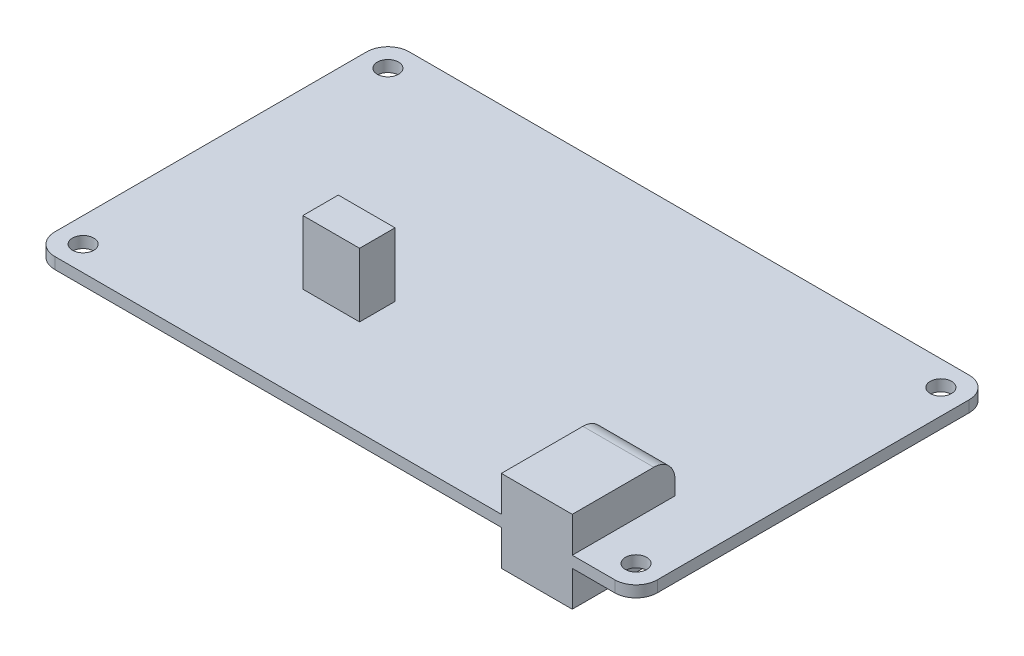
ISO-10303-21;
HEADER;
FILE_DESCRIPTION(('STEP AP214'),'2;1');
FILE_NAME('part.step','',(''),(''),'','','');
FILE_SCHEMA(('AUTOMOTIVE_DESIGN { 1 0 10303 214 1 1 1 1 }'));
ENDSEC;
DATA;
#1=APPLICATION_CONTEXT('core data for automotive mechanical design processes');
#2=APPLICATION_PROTOCOL_DEFINITION('international standard','automotive_design',2000,#1);
#3=PRODUCT_CONTEXT('',#1,'mechanical');
#4=PRODUCT('Part','Part','',(#3));
#5=PRODUCT_RELATED_PRODUCT_CATEGORY('part','',(#4));
#6=PRODUCT_DEFINITION_FORMATION('','',#4);
#7=PRODUCT_DEFINITION_CONTEXT('part definition',#1,'design');
#8=PRODUCT_DEFINITION('design','',#6,#7);
#9=PRODUCT_DEFINITION_SHAPE('','',#8);
#10=(LENGTH_UNIT() NAMED_UNIT(*) SI_UNIT(.MILLI.,.METRE.));
#11=(NAMED_UNIT(*) PLANE_ANGLE_UNIT() SI_UNIT($,.RADIAN.));
#12=(NAMED_UNIT(*) SI_UNIT($,.STERADIAN.) SOLID_ANGLE_UNIT());
#13=UNCERTAINTY_MEASURE_WITH_UNIT(LENGTH_MEASURE(1.E-05),#10,'distance_accuracy_value','');
#14=(GEOMETRIC_REPRESENTATION_CONTEXT(3) GLOBAL_UNCERTAINTY_ASSIGNED_CONTEXT((#13)) GLOBAL_UNIT_ASSIGNED_CONTEXT((#10,
#11,#12)) REPRESENTATION_CONTEXT('',''));
#15=CARTESIAN_POINT('',(0.,0.,0.));
#16=DIRECTION('',(0.,0.,1.));
#17=DIRECTION('',(1.,0.,0.));
#18=AXIS2_PLACEMENT_3D('',#15,#16,#17);
#19=CARTESIAN_POINT('',(0.,0.,0.));
#20=DIRECTION('',(0.,1.,0.));
#21=DIRECTION('',(0.,0.,1.));
#22=AXIS2_PLACEMENT_3D('',#19,#20,#21);
#23=PLANE('',#22);
#24=CARTESIAN_POINT('',(-39.,0.,21.5));
#25=DIRECTION('',(0.,1.,0.));
#26=DIRECTION('',(0.,0.,1.));
#27=AXIS2_PLACEMENT_3D('',#24,#25,#26);
#28=CIRCLE('',#27,1.5);
#29=CARTESIAN_POINT('',(-39.,0.,23.));
#30=VERTEX_POINT('',#29);
#31=EDGE_CURVE('E278',#30,#30,#28,.T.);
#32=ORIENTED_EDGE('',*,*,#31,.T.);
#33=EDGE_LOOP('',(#32));
#34=FACE_BOUND('',#33,.T.);
#35=CARTESIAN_POINT('',(39.,0.,21.5));
#36=DIRECTION('',(0.,1.,0.));
#37=DIRECTION('',(0.,0.,1.));
#38=AXIS2_PLACEMENT_3D('',#35,#36,#37);
#39=CIRCLE('',#38,1.5);
#40=CARTESIAN_POINT('',(39.,0.,23.));
#41=VERTEX_POINT('',#40);
#42=EDGE_CURVE('E282',#41,#41,#39,.T.);
#43=ORIENTED_EDGE('',*,*,#42,.T.);
#44=EDGE_LOOP('',(#43));
#45=FACE_BOUND('',#44,.T.);
#46=CARTESIAN_POINT('',(39.,0.,-21.5));
#47=DIRECTION('',(0.,1.,0.));
#48=DIRECTION('',(0.,0.,1.));
#49=AXIS2_PLACEMENT_3D('',#46,#47,#48);
#50=CIRCLE('',#49,1.5);
#51=CARTESIAN_POINT('',(39.,0.,-20.));
#52=VERTEX_POINT('',#51);
#53=EDGE_CURVE('E288',#52,#52,#50,.T.);
#54=ORIENTED_EDGE('',*,*,#53,.T.);
#55=EDGE_LOOP('',(#54));
#56=FACE_BOUND('',#55,.T.);
#57=CARTESIAN_POINT('',(-39.,0.,-21.5));
#58=DIRECTION('',(0.,1.,0.));
#59=DIRECTION('',(0.,0.,1.));
#60=AXIS2_PLACEMENT_3D('',#57,#58,#59);
#61=CIRCLE('',#60,1.5);
#62=CARTESIAN_POINT('',(-39.,0.,-20.));
#63=VERTEX_POINT('',#62);
#64=EDGE_CURVE('E294',#63,#63,#61,.T.);
#65=ORIENTED_EDGE('',*,*,#64,.T.);
#66=EDGE_LOOP('',(#65));
#67=FACE_BOUND('',#66,.T.);
#68=DIRECTION('',(0.,0.,1.));
#69=VECTOR('',#68,1.);
#70=CARTESIAN_POINT('',(33.5,0.,25.));
#71=LINE('',#70,#69);
#72=CARTESIAN_POINT('',(33.5,0.,10.5));
#73=VERTEX_POINT('',#72);
#74=CARTESIAN_POINT('',(33.5,0.,25.));
#75=VERTEX_POINT('',#74);
#76=EDGE_CURVE('E217',#73,#75,#71,.T.);
#77=ORIENTED_EDGE('',*,*,#76,.F.);
#78=DIRECTION('',(1.,0.,0.));
#79=VECTOR('',#78,1.);
#80=CARTESIAN_POINT('',(33.5,0.,10.5));
#81=LINE('',#80,#79);
#82=CARTESIAN_POINT('',(23.5,0.,10.5));
#83=VERTEX_POINT('',#82);
#84=EDGE_CURVE('E202',#83,#73,#81,.T.);
#85=ORIENTED_EDGE('',*,*,#84,.F.);
#86=DIRECTION('',(0.,0.,-1.));
#87=VECTOR('',#86,1.);
#88=CARTESIAN_POINT('',(23.5,0.,25.));
#89=LINE('',#88,#87);
#90=CARTESIAN_POINT('',(23.5,0.,25.));
#91=VERTEX_POINT('',#90);
#92=EDGE_CURVE('E458',#91,#83,#89,.T.);
#93=ORIENTED_EDGE('',*,*,#92,.F.);
#94=DIRECTION('',(1.,0.,0.));
#95=VECTOR('',#94,1.);
#96=CARTESIAN_POINT('',(-42.5,0.,25.));
#97=LINE('',#96,#95);
#98=CARTESIAN_POINT('',(-39.5,0.,25.));
#99=VERTEX_POINT('',#98);
#100=EDGE_CURVE('E307',#99,#91,#97,.T.);
#101=ORIENTED_EDGE('',*,*,#100,.F.);
#102=CARTESIAN_POINT('',(-39.5,0.,22.));
#103=DIRECTION('',(0.,1.,0.));
#104=DIRECTION('',(0.,0.,1.));
#105=AXIS2_PLACEMENT_3D('',#102,#103,#104);
#106=CIRCLE('',#105,3.);
#107=CARTESIAN_POINT('',(-42.5,0.,22.));
#108=VERTEX_POINT('',#107);
#109=EDGE_CURVE('E333',#99,#108,#106,.F.);
#110=ORIENTED_EDGE('',*,*,#109,.T.);
#111=DIRECTION('',(0.,0.,1.));
#112=VECTOR('',#111,1.);
#113=CARTESIAN_POINT('',(-42.5,0.,-25.));
#114=LINE('',#113,#112);
#115=CARTESIAN_POINT('',(-42.5,0.,-22.));
#116=VERTEX_POINT('',#115);
#117=EDGE_CURVE('E322',#116,#108,#114,.T.);
#118=ORIENTED_EDGE('',*,*,#117,.F.);
#119=CARTESIAN_POINT('',(-39.5,0.,-22.));
#120=DIRECTION('',(0.,1.,0.));
#121=DIRECTION('',(0.,0.,1.));
#122=AXIS2_PLACEMENT_3D('',#119,#120,#121);
#123=CIRCLE('',#122,3.);
#124=CARTESIAN_POINT('',(-39.5,0.,-25.));
#125=VERTEX_POINT('',#124);
#126=EDGE_CURVE('E331',#116,#125,#123,.F.);
#127=ORIENTED_EDGE('',*,*,#126,.T.);
#128=DIRECTION('',(-1.,0.,0.));
#129=VECTOR('',#128,1.);
#130=CARTESIAN_POINT('',(-42.5,0.,-25.));
#131=LINE('',#130,#129);
#132=CARTESIAN_POINT('',(39.5,0.,-25.));
#133=VERTEX_POINT('',#132);
#134=EDGE_CURVE('E319',#133,#125,#131,.T.);
#135=ORIENTED_EDGE('',*,*,#134,.F.);
#136=CARTESIAN_POINT('',(39.5,0.,-22.));
#137=DIRECTION('',(0.,1.,0.));
#138=DIRECTION('',(0.,0.,1.));
#139=AXIS2_PLACEMENT_3D('',#136,#137,#138);
#140=CIRCLE('',#139,3.);
#141=CARTESIAN_POINT('',(42.5,0.,-22.));
#142=VERTEX_POINT('',#141);
#143=EDGE_CURVE('E338',#133,#142,#140,.F.);
#144=ORIENTED_EDGE('',*,*,#143,.T.);
#145=DIRECTION('',(0.,0.,-1.));
#146=VECTOR('',#145,1.);
#147=CARTESIAN_POINT('',(42.5,0.,-25.));
#148=LINE('',#147,#146);
#149=CARTESIAN_POINT('',(42.5,0.,22.));
#150=VERTEX_POINT('',#149);
#151=EDGE_CURVE('E300',#150,#142,#148,.T.);
#152=ORIENTED_EDGE('',*,*,#151,.F.);
#153=CARTESIAN_POINT('',(39.5,0.,22.));
#154=DIRECTION('',(0.,1.,0.));
#155=DIRECTION('',(0.,0.,1.));
#156=AXIS2_PLACEMENT_3D('',#153,#154,#155);
#157=CIRCLE('',#156,3.);
#158=CARTESIAN_POINT('',(39.5,0.,25.));
#159=VERTEX_POINT('',#158);
#160=EDGE_CURVE('E335',#150,#159,#157,.F.);
#161=ORIENTED_EDGE('',*,*,#160,.T.);
#162=EDGE_CURVE('E325',#75,#159,#97,.T.);
#163=ORIENTED_EDGE('',*,*,#162,.F.);
#164=EDGE_LOOP('',(#77,#85,#93,#101,#110,#118,#127,#135,#144,#152,#161,#163));
#165=FACE_BOUND('',#164,.T.);
#166=ADVANCED_FACE('F45',(#34,#45,#56,#67,#165),#23,.F.);
#167=CARTESIAN_POINT('',(0.,1.6,0.));
#168=DIRECTION('',(0.,1.,0.));
#169=DIRECTION('',(0.,0.,1.));
#170=AXIS2_PLACEMENT_3D('',#167,#168,#169);
#171=PLANE('',#170);
#172=DIRECTION('',(0.,0.,-1.));
#173=VECTOR('',#172,1.);
#174=CARTESIAN_POINT('',(33.5,1.6,25.));
#175=LINE('',#174,#173);
#176=CARTESIAN_POINT('',(33.5,1.6,25.));
#177=VERTEX_POINT('',#176);
#178=CARTESIAN_POINT('',(33.5,1.6,10.5));
#179=VERTEX_POINT('',#178);
#180=EDGE_CURVE('E252',#177,#179,#175,.T.);
#181=ORIENTED_EDGE('',*,*,#180,.F.);
#182=DIRECTION('',(1.,0.,0.));
#183=VECTOR('',#182,1.);
#184=CARTESIAN_POINT('',(-42.5,1.6,25.));
#185=LINE('',#184,#183);
#186=CARTESIAN_POINT('',(39.5,1.6,25.));
#187=VERTEX_POINT('',#186);
#188=EDGE_CURVE('E313',#177,#187,#185,.T.);
#189=ORIENTED_EDGE('',*,*,#188,.T.);
#190=CARTESIAN_POINT('',(39.5,1.6,22.));
#191=DIRECTION('',(0.,1.,0.));
#192=DIRECTION('',(0.,0.,1.));
#193=AXIS2_PLACEMENT_3D('',#190,#191,#192);
#194=CIRCLE('',#193,3.);
#195=CARTESIAN_POINT('',(42.5,1.6,22.));
#196=VERTEX_POINT('',#195);
#197=EDGE_CURVE('E349',#187,#196,#194,.T.);
#198=ORIENTED_EDGE('',*,*,#197,.T.);
#199=DIRECTION('',(0.,0.,-1.));
#200=VECTOR('',#199,1.);
#201=CARTESIAN_POINT('',(42.5,1.6,-25.));
#202=LINE('',#201,#200);
#203=CARTESIAN_POINT('',(42.5,1.6,-22.));
#204=VERTEX_POINT('',#203);
#205=EDGE_CURVE('E303',#196,#204,#202,.T.);
#206=ORIENTED_EDGE('',*,*,#205,.T.);
#207=CARTESIAN_POINT('',(39.5,1.6,-22.));
#208=DIRECTION('',(0.,1.,0.));
#209=DIRECTION('',(0.,0.,1.));
#210=AXIS2_PLACEMENT_3D('',#207,#208,#209);
#211=CIRCLE('',#210,3.);
#212=CARTESIAN_POINT('',(39.5,1.6,-25.));
#213=VERTEX_POINT('',#212);
#214=EDGE_CURVE('E351',#204,#213,#211,.T.);
#215=ORIENTED_EDGE('',*,*,#214,.T.);
#216=DIRECTION('',(-1.,0.,0.));
#217=VECTOR('',#216,1.);
#218=CARTESIAN_POINT('',(-42.5,1.6,-25.));
#219=LINE('',#218,#217);
#220=CARTESIAN_POINT('',(-39.5,1.6,-25.));
#221=VERTEX_POINT('',#220);
#222=EDGE_CURVE('E306',#213,#221,#219,.T.);
#223=ORIENTED_EDGE('',*,*,#222,.T.);
#224=CARTESIAN_POINT('',(-39.5,1.6,-22.));
#225=DIRECTION('',(0.,1.,0.));
#226=DIRECTION('',(0.,0.,1.));
#227=AXIS2_PLACEMENT_3D('',#224,#225,#226);
#228=CIRCLE('',#227,3.);
#229=CARTESIAN_POINT('',(-42.5,1.6,-22.));
#230=VERTEX_POINT('',#229);
#231=EDGE_CURVE('E345',#221,#230,#228,.T.);
#232=ORIENTED_EDGE('',*,*,#231,.T.);
#233=DIRECTION('',(0.,0.,1.));
#234=VECTOR('',#233,1.);
#235=CARTESIAN_POINT('',(-42.5,1.6,-25.));
#236=LINE('',#235,#234);
#237=CARTESIAN_POINT('',(-42.5,1.6,22.));
#238=VERTEX_POINT('',#237);
#239=EDGE_CURVE('E310',#230,#238,#236,.T.);
#240=ORIENTED_EDGE('',*,*,#239,.T.);
#241=CARTESIAN_POINT('',(-39.5,1.6,22.));
#242=DIRECTION('',(0.,1.,0.));
#243=DIRECTION('',(0.,0.,1.));
#244=AXIS2_PLACEMENT_3D('',#241,#242,#243);
#245=CIRCLE('',#244,3.);
#246=CARTESIAN_POINT('',(-39.5,1.6,25.));
#247=VERTEX_POINT('',#246);
#248=EDGE_CURVE('E347',#238,#247,#245,.T.);
#249=ORIENTED_EDGE('',*,*,#248,.T.);
#250=CARTESIAN_POINT('',(23.5,1.6,25.));
#251=VERTEX_POINT('',#250);
#252=EDGE_CURVE('E314',#247,#251,#185,.T.);
#253=ORIENTED_EDGE('',*,*,#252,.T.);
#254=DIRECTION('',(0.,0.,1.));
#255=VECTOR('',#254,1.);
#256=CARTESIAN_POINT('',(23.5,1.6,25.));
#257=LINE('',#256,#255);
#258=CARTESIAN_POINT('',(23.5,1.6,10.5));
#259=VERTEX_POINT('',#258);
#260=EDGE_CURVE('E257',#259,#251,#257,.T.);
#261=ORIENTED_EDGE('',*,*,#260,.F.);
#262=DIRECTION('',(-1.,0.,0.));
#263=VECTOR('',#262,1.);
#264=CARTESIAN_POINT('',(33.5,1.6,10.5));
#265=LINE('',#264,#263);
#266=EDGE_CURVE('E264',#179,#259,#265,.T.);
#267=ORIENTED_EDGE('',*,*,#266,.F.);
#268=EDGE_LOOP('',(#181,#189,#198,#206,#215,#223,#232,#240,#249,#253,#261,#267));
#269=FACE_BOUND('',#268,.T.);
#270=CARTESIAN_POINT('',(39.,1.6,21.5));
#271=DIRECTION('',(0.,1.,0.));
#272=DIRECTION('',(0.,0.,1.));
#273=AXIS2_PLACEMENT_3D('',#270,#271,#272);
#274=CIRCLE('',#273,1.5);
#275=CARTESIAN_POINT('',(39.,1.6,23.));
#276=VERTEX_POINT('',#275);
#277=EDGE_CURVE('E285',#276,#276,#274,.T.);
#278=ORIENTED_EDGE('',*,*,#277,.F.);
#279=EDGE_LOOP('',(#278));
#280=FACE_BOUND('',#279,.T.);
#281=CARTESIAN_POINT('',(-39.,1.6,-21.5));
#282=DIRECTION('',(0.,1.,0.));
#283=DIRECTION('',(0.,0.,1.));
#284=AXIS2_PLACEMENT_3D('',#281,#282,#283);
#285=CIRCLE('',#284,1.5);
#286=CARTESIAN_POINT('',(-39.,1.6,-20.));
#287=VERTEX_POINT('',#286);
#288=EDGE_CURVE('E297',#287,#287,#285,.T.);
#289=ORIENTED_EDGE('',*,*,#288,.F.);
#290=EDGE_LOOP('',(#289));
#291=FACE_BOUND('',#290,.T.);
#292=CARTESIAN_POINT('',(39.,1.6,-21.5));
#293=DIRECTION('',(0.,1.,0.));
#294=DIRECTION('',(0.,0.,1.));
#295=AXIS2_PLACEMENT_3D('',#292,#293,#294);
#296=CIRCLE('',#295,1.5);
#297=CARTESIAN_POINT('',(39.,1.6,-20.));
#298=VERTEX_POINT('',#297);
#299=EDGE_CURVE('E291',#298,#298,#296,.T.);
#300=ORIENTED_EDGE('',*,*,#299,.F.);
#301=EDGE_LOOP('',(#300));
#302=FACE_BOUND('',#301,.T.);
#303=CARTESIAN_POINT('',(-39.,1.6,21.5));
#304=DIRECTION('',(0.,1.,0.));
#305=DIRECTION('',(0.,0.,1.));
#306=AXIS2_PLACEMENT_3D('',#303,#304,#305);
#307=CIRCLE('',#306,1.5);
#308=CARTESIAN_POINT('',(-39.,1.6,23.));
#309=VERTEX_POINT('',#308);
#310=EDGE_CURVE('E279',#309,#309,#307,.T.);
#311=ORIENTED_EDGE('',*,*,#310,.F.);
#312=EDGE_LOOP('',(#311));
#313=FACE_BOUND('',#312,.T.);
#314=DIRECTION('',(1.,0.,0.));
#315=VECTOR('',#314,1.);
#316=CARTESIAN_POINT('',(-18.,1.6,11.5));
#317=LINE('',#316,#315);
#318=CARTESIAN_POINT('',(-18.,1.6,11.5));
#319=VERTEX_POINT('',#318);
#320=CARTESIAN_POINT('',(-9.99999999999999,1.6,11.5));
#321=VERTEX_POINT('',#320);
#322=EDGE_CURVE('E221',#319,#321,#317,.T.);
#323=ORIENTED_EDGE('',*,*,#322,.F.);
#324=DIRECTION('',(0.,0.,1.));
#325=VECTOR('',#324,1.);
#326=CARTESIAN_POINT('',(-18.,1.6,6.5));
#327=LINE('',#326,#325);
#328=CARTESIAN_POINT('',(-18.,1.6,6.5));
#329=VERTEX_POINT('',#328);
#330=EDGE_CURVE('E218',#329,#319,#327,.T.);
#331=ORIENTED_EDGE('',*,*,#330,.F.);
#332=DIRECTION('',(-1.,0.,0.));
#333=VECTOR('',#332,1.);
#334=CARTESIAN_POINT('',(-18.,1.6,6.5));
#335=LINE('',#334,#333);
#336=CARTESIAN_POINT('',(-9.99999999999999,1.6,6.5));
#337=VERTEX_POINT('',#336);
#338=EDGE_CURVE('E231',#337,#329,#335,.T.);
#339=ORIENTED_EDGE('',*,*,#338,.F.);
#340=DIRECTION('',(0.,0.,-1.));
#341=VECTOR('',#340,1.);
#342=CARTESIAN_POINT('',(-9.99999999999999,1.6,6.5));
#343=LINE('',#342,#341);
#344=EDGE_CURVE('E239',#321,#337,#343,.T.);
#345=ORIENTED_EDGE('',*,*,#344,.F.);
#346=EDGE_LOOP('',(#323,#331,#339,#345));
#347=FACE_BOUND('',#346,.T.);
#348=ADVANCED_FACE('F396',(#269,#280,#291,#302,#313,#347),#171,.T.);
#349=CARTESIAN_POINT('',(42.5,1.6,-25.));
#350=DIRECTION('',(-1.,0.,0.));
#351=DIRECTION('',(0.,0.,1.));
#352=AXIS2_PLACEMENT_3D('',#349,#350,#351);
#353=PLANE('',#352);
#354=ORIENTED_EDGE('',*,*,#151,.T.);
#355=DIRECTION('',(0.,-1.,0.));
#356=VECTOR('',#355,1.);
#357=CARTESIAN_POINT('',(42.5,1.6,-22.));
#358=LINE('',#357,#356);
#359=EDGE_CURVE('E343',#142,#204,#358,.F.);
#360=ORIENTED_EDGE('',*,*,#359,.T.);
#361=ORIENTED_EDGE('',*,*,#205,.F.);
#362=DIRECTION('',(0.,-1.,0.));
#363=VECTOR('',#362,1.);
#364=CARTESIAN_POINT('',(42.5,1.6,22.));
#365=LINE('',#364,#363);
#366=EDGE_CURVE('E340',#196,#150,#365,.T.);
#367=ORIENTED_EDGE('',*,*,#366,.T.);
#368=EDGE_LOOP('',(#354,#360,#361,#367));
#369=FACE_BOUND('',#368,.T.);
#370=ADVANCED_FACE('F402',(#369),#353,.F.);
#371=CARTESIAN_POINT('',(-42.5,1.6,-25.));
#372=DIRECTION('',(0.,0.,1.));
#373=DIRECTION('',(1.,0.,0.));
#374=AXIS2_PLACEMENT_3D('',#371,#372,#373);
#375=PLANE('',#374);
#376=ORIENTED_EDGE('',*,*,#222,.F.);
#377=DIRECTION('',(0.,-1.,0.));
#378=VECTOR('',#377,1.);
#379=CARTESIAN_POINT('',(39.5,1.6,-25.));
#380=LINE('',#379,#378);
#381=EDGE_CURVE('E328',#213,#133,#380,.T.);
#382=ORIENTED_EDGE('',*,*,#381,.T.);
#383=ORIENTED_EDGE('',*,*,#134,.T.);
#384=DIRECTION('',(0.,-1.,0.));
#385=VECTOR('',#384,1.);
#386=CARTESIAN_POINT('',(-39.5,1.6,-25.));
#387=LINE('',#386,#385);
#388=EDGE_CURVE('E316',#125,#221,#387,.F.);
#389=ORIENTED_EDGE('',*,*,#388,.T.);
#390=EDGE_LOOP('',(#376,#382,#383,#389));
#391=FACE_BOUND('',#390,.T.);
#392=ADVANCED_FACE('F414',(#391),#375,.F.);
#393=CARTESIAN_POINT('',(-42.5,1.6,-25.));
#394=DIRECTION('',(1.,0.,0.));
#395=DIRECTION('',(0.,0.,-1.));
#396=AXIS2_PLACEMENT_3D('',#393,#394,#395);
#397=PLANE('',#396);
#398=ORIENTED_EDGE('',*,*,#117,.T.);
#399=DIRECTION('',(0.,-1.,0.));
#400=VECTOR('',#399,1.);
#401=CARTESIAN_POINT('',(-42.5,1.6,22.));
#402=LINE('',#401,#400);
#403=EDGE_CURVE('E362',#108,#238,#402,.F.);
#404=ORIENTED_EDGE('',*,*,#403,.T.);
#405=ORIENTED_EDGE('',*,*,#239,.F.);
#406=DIRECTION('',(0.,-1.,0.));
#407=VECTOR('',#406,1.);
#408=CARTESIAN_POINT('',(-42.5,1.6,-22.));
#409=LINE('',#408,#407);
#410=EDGE_CURVE('E359',#230,#116,#409,.T.);
#411=ORIENTED_EDGE('',*,*,#410,.T.);
#412=EDGE_LOOP('',(#398,#404,#405,#411));
#413=FACE_BOUND('',#412,.T.);
#414=ADVANCED_FACE('F411',(#413),#397,.F.);
#415=CARTESIAN_POINT('',(-42.5,1.6,25.));
#416=DIRECTION('',(0.,0.,-1.));
#417=DIRECTION('',(-1.,0.,0.));
#418=AXIS2_PLACEMENT_3D('',#415,#416,#417);
#419=PLANE('',#418);
#420=ORIENTED_EDGE('',*,*,#100,.T.);
#421=DIRECTION('',(0.,1.,0.));
#422=VECTOR('',#421,1.);
#423=CARTESIAN_POINT('',(23.5,-5.,25.));
#424=LINE('',#423,#422);
#425=CARTESIAN_POINT('',(23.5,-5.,25.));
#426=VERTEX_POINT('',#425);
#427=EDGE_CURVE('E211',#426,#91,#424,.T.);
#428=ORIENTED_EDGE('',*,*,#427,.F.);
#429=DIRECTION('',(-1.,0.,0.));
#430=VECTOR('',#429,1.);
#431=CARTESIAN_POINT('',(33.5,-5.,25.));
#432=LINE('',#431,#430);
#433=CARTESIAN_POINT('',(33.5,-5.,25.));
#434=VERTEX_POINT('',#433);
#435=EDGE_CURVE('E196',#434,#426,#432,.T.);
#436=ORIENTED_EDGE('',*,*,#435,.F.);
#437=DIRECTION('',(0.,1.,0.));
#438=VECTOR('',#437,1.);
#439=CARTESIAN_POINT('',(33.5,-5.,25.));
#440=LINE('',#439,#438);
#441=EDGE_CURVE('E208',#434,#75,#440,.T.);
#442=ORIENTED_EDGE('',*,*,#441,.T.);
#443=ORIENTED_EDGE('',*,*,#162,.T.);
#444=DIRECTION('',(0.,-1.,0.));
#445=VECTOR('',#444,1.);
#446=CARTESIAN_POINT('',(39.5,1.6,25.));
#447=LINE('',#446,#445);
#448=EDGE_CURVE('E356',#159,#187,#447,.F.);
#449=ORIENTED_EDGE('',*,*,#448,.T.);
#450=ORIENTED_EDGE('',*,*,#188,.F.);
#451=DIRECTION('',(0.,-1.,0.));
#452=VECTOR('',#451,1.);
#453=CARTESIAN_POINT('',(33.5,6.6,25.));
#454=LINE('',#453,#452);
#455=CARTESIAN_POINT('',(33.5,6.6,25.));
#456=VERTEX_POINT('',#455);
#457=EDGE_CURVE('E261',#456,#177,#454,.T.);
#458=ORIENTED_EDGE('',*,*,#457,.F.);
#459=DIRECTION('',(1.,0.,0.));
#460=VECTOR('',#459,1.);
#461=CARTESIAN_POINT('',(33.5,6.6,25.));
#462=LINE('',#461,#460);
#463=CARTESIAN_POINT('',(23.5,6.6,25.));
#464=VERTEX_POINT('',#463);
#465=EDGE_CURVE('E259',#464,#456,#462,.T.);
#466=ORIENTED_EDGE('',*,*,#465,.F.);
#467=DIRECTION('',(0.,-1.,0.));
#468=VECTOR('',#467,1.);
#469=CARTESIAN_POINT('',(23.5,6.6,25.));
#470=LINE('',#469,#468);
#471=EDGE_CURVE('E271',#464,#251,#470,.T.);
#472=ORIENTED_EDGE('',*,*,#471,.T.);
#473=ORIENTED_EDGE('',*,*,#252,.F.);
#474=DIRECTION('',(0.,-1.,0.));
#475=VECTOR('',#474,1.);
#476=CARTESIAN_POINT('',(-39.5,1.6,25.));
#477=LINE('',#476,#475);
#478=EDGE_CURVE('E353',#247,#99,#477,.T.);
#479=ORIENTED_EDGE('',*,*,#478,.T.);
#480=EDGE_LOOP('',(#420,#428,#436,#442,#443,#449,#450,#458,#466,#472,#473,#479));
#481=FACE_BOUND('',#480,.T.);
#482=ADVANCED_FACE('F207',(#481),#419,.F.);
#483=CARTESIAN_POINT('',(-39.,1.6,-21.5));
#484=DIRECTION('',(0.,-1.,0.));
#485=DIRECTION('',(0.,0.,-1.));
#486=AXIS2_PLACEMENT_3D('',#483,#484,#485);
#487=CYLINDRICAL_SURFACE('',#486,1.5);
#488=ORIENTED_EDGE('',*,*,#288,.T.);
#489=EDGE_LOOP('',(#488));
#490=FACE_BOUND('',#489,.T.);
#491=ORIENTED_EDGE('',*,*,#64,.F.);
#492=EDGE_LOOP('',(#491));
#493=FACE_BOUND('',#492,.T.);
#494=ADVANCED_FACE('F410',(#490,#493),#487,.F.);
#495=CARTESIAN_POINT('',(39.,1.6,-21.5));
#496=DIRECTION('',(0.,-1.,0.));
#497=DIRECTION('',(0.,0.,-1.));
#498=AXIS2_PLACEMENT_3D('',#495,#496,#497);
#499=CYLINDRICAL_SURFACE('',#498,1.5);
#500=ORIENTED_EDGE('',*,*,#299,.T.);
#501=EDGE_LOOP('',(#500));
#502=FACE_BOUND('',#501,.T.);
#503=ORIENTED_EDGE('',*,*,#53,.F.);
#504=EDGE_LOOP('',(#503));
#505=FACE_BOUND('',#504,.T.);
#506=ADVANCED_FACE('F498',(#502,#505),#499,.F.);
#507=CARTESIAN_POINT('',(39.,1.6,21.5));
#508=DIRECTION('',(0.,-1.,0.));
#509=DIRECTION('',(0.,0.,-1.));
#510=AXIS2_PLACEMENT_3D('',#507,#508,#509);
#511=CYLINDRICAL_SURFACE('',#510,1.5);
#512=ORIENTED_EDGE('',*,*,#277,.T.);
#513=EDGE_LOOP('',(#512));
#514=FACE_BOUND('',#513,.T.);
#515=ORIENTED_EDGE('',*,*,#42,.F.);
#516=EDGE_LOOP('',(#515));
#517=FACE_BOUND('',#516,.T.);
#518=ADVANCED_FACE('F494',(#514,#517),#511,.F.);
#519=CARTESIAN_POINT('',(-39.,1.6,21.5));
#520=DIRECTION('',(0.,-1.,0.));
#521=DIRECTION('',(0.,0.,-1.));
#522=AXIS2_PLACEMENT_3D('',#519,#520,#521);
#523=CYLINDRICAL_SURFACE('',#522,1.5);
#524=ORIENTED_EDGE('',*,*,#310,.T.);
#525=EDGE_LOOP('',(#524));
#526=FACE_BOUND('',#525,.T.);
#527=ORIENTED_EDGE('',*,*,#31,.F.);
#528=EDGE_LOOP('',(#527));
#529=FACE_BOUND('',#528,.T.);
#530=ADVANCED_FACE('F426',(#526,#529),#523,.F.);
#531=CARTESIAN_POINT('',(39.5,1.6,-22.));
#532=DIRECTION('',(0.,-1.,0.));
#533=DIRECTION('',(0.,0.,-1.));
#534=AXIS2_PLACEMENT_3D('',#531,#532,#533);
#535=CYLINDRICAL_SURFACE('',#534,3.);
#536=ORIENTED_EDGE('',*,*,#214,.F.);
#537=ORIENTED_EDGE('',*,*,#359,.F.);
#538=ORIENTED_EDGE('',*,*,#143,.F.);
#539=ORIENTED_EDGE('',*,*,#381,.F.);
#540=EDGE_LOOP('',(#536,#537,#538,#539));
#541=FACE_BOUND('',#540,.T.);
#542=ADVANCED_FACE('F422',(#541),#535,.T.);
#543=CARTESIAN_POINT('',(39.5,1.6,22.));
#544=DIRECTION('',(0.,-1.,0.));
#545=DIRECTION('',(0.,0.,-1.));
#546=AXIS2_PLACEMENT_3D('',#543,#544,#545);
#547=CYLINDRICAL_SURFACE('',#546,3.);
#548=ORIENTED_EDGE('',*,*,#197,.F.);
#549=ORIENTED_EDGE('',*,*,#448,.F.);
#550=ORIENTED_EDGE('',*,*,#160,.F.);
#551=ORIENTED_EDGE('',*,*,#366,.F.);
#552=EDGE_LOOP('',(#548,#549,#550,#551));
#553=FACE_BOUND('',#552,.T.);
#554=ADVANCED_FACE('F425',(#553),#547,.T.);
#555=CARTESIAN_POINT('',(-39.5,1.6,22.));
#556=DIRECTION('',(0.,-1.,0.));
#557=DIRECTION('',(0.,0.,-1.));
#558=AXIS2_PLACEMENT_3D('',#555,#556,#557);
#559=CYLINDRICAL_SURFACE('',#558,3.);
#560=ORIENTED_EDGE('',*,*,#248,.F.);
#561=ORIENTED_EDGE('',*,*,#403,.F.);
#562=ORIENTED_EDGE('',*,*,#109,.F.);
#563=ORIENTED_EDGE('',*,*,#478,.F.);
#564=EDGE_LOOP('',(#560,#561,#562,#563));
#565=FACE_BOUND('',#564,.T.);
#566=ADVANCED_FACE('F430',(#565),#559,.T.);
#567=CARTESIAN_POINT('',(-39.5,1.6,-22.));
#568=DIRECTION('',(0.,-1.,0.));
#569=DIRECTION('',(0.,0.,-1.));
#570=AXIS2_PLACEMENT_3D('',#567,#568,#569);
#571=CYLINDRICAL_SURFACE('',#570,3.);
#572=ORIENTED_EDGE('',*,*,#231,.F.);
#573=ORIENTED_EDGE('',*,*,#388,.F.);
#574=ORIENTED_EDGE('',*,*,#126,.F.);
#575=ORIENTED_EDGE('',*,*,#410,.F.);
#576=EDGE_LOOP('',(#572,#573,#574,#575));
#577=FACE_BOUND('',#576,.T.);
#578=ADVANCED_FACE('F434',(#577),#571,.T.);
#579=CARTESIAN_POINT('',(33.5,6.6,25.));
#580=DIRECTION('',(-1.,0.,0.));
#581=DIRECTION('',(0.,0.,1.));
#582=AXIS2_PLACEMENT_3D('',#579,#580,#581);
#583=PLANE('',#582);
#584=DIRECTION('',(0.,-1.,0.));
#585=VECTOR('',#584,1.);
#586=CARTESIAN_POINT('',(33.5,6.6,10.5));
#587=LINE('',#586,#585);
#588=CARTESIAN_POINT('',(33.5,3.6,10.5));
#589=VERTEX_POINT('',#588);
#590=EDGE_CURVE('E276',#589,#179,#587,.T.);
#591=ORIENTED_EDGE('',*,*,#590,.F.);
#592=CARTESIAN_POINT('',(33.5,3.6,13.5));
#593=DIRECTION('',(-1.,0.,0.));
#594=DIRECTION('',(0.,0.,1.));
#595=AXIS2_PLACEMENT_3D('',#592,#593,#594);
#596=CIRCLE('',#595,3.);
#597=CARTESIAN_POINT('',(33.5,6.6,13.5));
#598=VERTEX_POINT('',#597);
#599=EDGE_CURVE('E11',#589,#598,#596,.F.);
#600=ORIENTED_EDGE('',*,*,#599,.T.);
#601=DIRECTION('',(0.,0.,-1.));
#602=VECTOR('',#601,1.);
#603=CARTESIAN_POINT('',(33.5,6.6,25.));
#604=LINE('',#603,#602);
#605=EDGE_CURVE('E253',#456,#598,#604,.T.);
#606=ORIENTED_EDGE('',*,*,#605,.F.);
#607=ORIENTED_EDGE('',*,*,#457,.T.);
#608=ORIENTED_EDGE('',*,*,#180,.T.);
#609=EDGE_LOOP('',(#591,#600,#606,#607,#608));
#610=FACE_BOUND('',#609,.T.);
#611=ADVANCED_FACE('F388',(#610),#583,.F.);
#612=CARTESIAN_POINT('',(33.5,6.6,10.5));
#613=DIRECTION('',(0.,0.,1.));
#614=DIRECTION('',(1.,0.,0.));
#615=AXIS2_PLACEMENT_3D('',#612,#613,#614);
#616=PLANE('',#615);
#617=DIRECTION('',(0.,-1.,0.));
#618=VECTOR('',#617,1.);
#619=CARTESIAN_POINT('',(23.5,6.6,10.5));
#620=LINE('',#619,#618);
#621=CARTESIAN_POINT('',(23.5,3.6,10.5));
#622=VERTEX_POINT('',#621);
#623=EDGE_CURVE('E274',#622,#259,#620,.T.);
#624=ORIENTED_EDGE('',*,*,#623,.F.);
#625=DIRECTION('',(-1.,0.,0.));
#626=VECTOR('',#625,1.);
#627=CARTESIAN_POINT('',(33.5,3.6,10.5));
#628=LINE('',#627,#626);
#629=EDGE_CURVE('E53',#622,#589,#628,.F.);
#630=ORIENTED_EDGE('',*,*,#629,.T.);
#631=ORIENTED_EDGE('',*,*,#590,.T.);
#632=ORIENTED_EDGE('',*,*,#266,.T.);
#633=EDGE_LOOP('',(#624,#630,#631,#632));
#634=FACE_BOUND('',#633,.T.);
#635=ADVANCED_FACE('F442',(#634),#616,.F.);
#636=CARTESIAN_POINT('',(23.5,6.6,25.));
#637=DIRECTION('',(1.,0.,0.));
#638=DIRECTION('',(0.,0.,-1.));
#639=AXIS2_PLACEMENT_3D('',#636,#637,#638);
#640=PLANE('',#639);
#641=DIRECTION('',(0.,0.,1.));
#642=VECTOR('',#641,1.);
#643=CARTESIAN_POINT('',(23.5,6.6,25.));
#644=LINE('',#643,#642);
#645=CARTESIAN_POINT('',(23.5,6.6,13.5));
#646=VERTEX_POINT('',#645);
#647=EDGE_CURVE('E256',#646,#464,#644,.T.);
#648=ORIENTED_EDGE('',*,*,#647,.F.);
#649=CARTESIAN_POINT('',(23.5,3.6,13.5));
#650=DIRECTION('',(1.,0.,0.));
#651=DIRECTION('',(0.,0.,-1.));
#652=AXIS2_PLACEMENT_3D('',#649,#650,#651);
#653=CIRCLE('',#652,3.);
#654=EDGE_CURVE('E67',#646,#622,#653,.F.);
#655=ORIENTED_EDGE('',*,*,#654,.T.);
#656=ORIENTED_EDGE('',*,*,#623,.T.);
#657=ORIENTED_EDGE('',*,*,#260,.T.);
#658=ORIENTED_EDGE('',*,*,#471,.F.);
#659=EDGE_LOOP('',(#648,#655,#656,#657,#658));
#660=FACE_BOUND('',#659,.T.);
#661=ADVANCED_FACE('F381',(#660),#640,.F.);
#662=CARTESIAN_POINT('',(0.,6.6,0.));
#663=DIRECTION('',(0.,1.,0.));
#664=DIRECTION('',(0.,0.,1.));
#665=AXIS2_PLACEMENT_3D('',#662,#663,#664);
#666=PLANE('',#665);
#667=ORIENTED_EDGE('',*,*,#605,.T.);
#668=DIRECTION('',(-1.,0.,0.));
#669=VECTOR('',#668,1.);
#670=CARTESIAN_POINT('',(23.5,6.6,13.5));
#671=LINE('',#670,#669);
#672=EDGE_CURVE('E371',#598,#646,#671,.T.);
#673=ORIENTED_EDGE('',*,*,#672,.T.);
#674=ORIENTED_EDGE('',*,*,#647,.T.);
#675=ORIENTED_EDGE('',*,*,#465,.T.);
#676=EDGE_LOOP('',(#667,#673,#674,#675));
#677=FACE_BOUND('',#676,.T.);
#678=ADVANCED_FACE('F376',(#677),#666,.T.);
#679=CARTESIAN_POINT('',(-18.,10.6,6.5));
#680=DIRECTION('',(1.,0.,0.));
#681=DIRECTION('',(0.,0.,-1.));
#682=AXIS2_PLACEMENT_3D('',#679,#680,#681);
#683=PLANE('',#682);
#684=ORIENTED_EDGE('',*,*,#330,.T.);
#685=DIRECTION('',(0.,-1.,0.));
#686=VECTOR('',#685,1.);
#687=CARTESIAN_POINT('',(-18.,10.6,11.5));
#688=LINE('',#687,#686);
#689=CARTESIAN_POINT('',(-18.,10.6,11.5));
#690=VERTEX_POINT('',#689);
#691=EDGE_CURVE('E250',#690,#319,#688,.T.);
#692=ORIENTED_EDGE('',*,*,#691,.F.);
#693=DIRECTION('',(0.,0.,1.));
#694=VECTOR('',#693,1.);
#695=CARTESIAN_POINT('',(-18.,10.6,6.5));
#696=LINE('',#695,#694);
#697=CARTESIAN_POINT('',(-18.,10.6,6.5));
#698=VERTEX_POINT('',#697);
#699=EDGE_CURVE('E227',#698,#690,#696,.T.);
#700=ORIENTED_EDGE('',*,*,#699,.F.);
#701=DIRECTION('',(0.,-1.,0.));
#702=VECTOR('',#701,1.);
#703=CARTESIAN_POINT('',(-18.,10.6,6.5));
#704=LINE('',#703,#702);
#705=EDGE_CURVE('E236',#698,#329,#704,.T.);
#706=ORIENTED_EDGE('',*,*,#705,.T.);
#707=EDGE_LOOP('',(#684,#692,#700,#706));
#708=FACE_BOUND('',#707,.T.);
#709=ADVANCED_FACE('F534',(#708),#683,.F.);
#710=CARTESIAN_POINT('',(-18.,10.6,11.5));
#711=DIRECTION('',(0.,0.,-1.));
#712=DIRECTION('',(-1.,0.,0.));
#713=AXIS2_PLACEMENT_3D('',#710,#711,#712);
#714=PLANE('',#713);
#715=ORIENTED_EDGE('',*,*,#322,.T.);
#716=DIRECTION('',(0.,-1.,0.));
#717=VECTOR('',#716,1.);
#718=CARTESIAN_POINT('',(-9.99999999999999,10.6,11.5));
#719=LINE('',#718,#717);
#720=CARTESIAN_POINT('',(-9.99999999999999,10.6,11.5));
#721=VERTEX_POINT('',#720);
#722=EDGE_CURVE('E247',#721,#321,#719,.T.);
#723=ORIENTED_EDGE('',*,*,#722,.F.);
#724=DIRECTION('',(1.,0.,0.));
#725=VECTOR('',#724,1.);
#726=CARTESIAN_POINT('',(-18.,10.6,11.5));
#727=LINE('',#726,#725);
#728=EDGE_CURVE('E230',#690,#721,#727,.T.);
#729=ORIENTED_EDGE('',*,*,#728,.F.);
#730=ORIENTED_EDGE('',*,*,#691,.T.);
#731=EDGE_LOOP('',(#715,#723,#729,#730));
#732=FACE_BOUND('',#731,.T.);
#733=ADVANCED_FACE('F522',(#732),#714,.F.);
#734=CARTESIAN_POINT('',(-9.99999999999999,10.6,6.5));
#735=DIRECTION('',(-1.,0.,0.));
#736=DIRECTION('',(0.,0.,1.));
#737=AXIS2_PLACEMENT_3D('',#734,#735,#736);
#738=PLANE('',#737);
#739=ORIENTED_EDGE('',*,*,#344,.T.);
#740=DIRECTION('',(0.,-1.,0.));
#741=VECTOR('',#740,1.);
#742=CARTESIAN_POINT('',(-9.99999999999999,10.6,6.5));
#743=LINE('',#742,#741);
#744=CARTESIAN_POINT('',(-9.99999999999999,10.6,6.5));
#745=VERTEX_POINT('',#744);
#746=EDGE_CURVE('E245',#745,#337,#743,.T.);
#747=ORIENTED_EDGE('',*,*,#746,.F.);
#748=DIRECTION('',(0.,0.,-1.));
#749=VECTOR('',#748,1.);
#750=CARTESIAN_POINT('',(-9.99999999999999,10.6,6.5));
#751=LINE('',#750,#749);
#752=EDGE_CURVE('E233',#721,#745,#751,.T.);
#753=ORIENTED_EDGE('',*,*,#752,.F.);
#754=ORIENTED_EDGE('',*,*,#722,.T.);
#755=EDGE_LOOP('',(#739,#747,#753,#754));
#756=FACE_BOUND('',#755,.T.);
#757=ADVANCED_FACE('F526',(#756),#738,.F.);
#758=CARTESIAN_POINT('',(-18.,10.6,6.5));
#759=DIRECTION('',(0.,0.,1.));
#760=DIRECTION('',(1.,0.,0.));
#761=AXIS2_PLACEMENT_3D('',#758,#759,#760);
#762=PLANE('',#761);
#763=ORIENTED_EDGE('',*,*,#338,.T.);
#764=ORIENTED_EDGE('',*,*,#705,.F.);
#765=DIRECTION('',(-1.,0.,0.));
#766=VECTOR('',#765,1.);
#767=CARTESIAN_POINT('',(-18.,10.6,6.5));
#768=LINE('',#767,#766);
#769=EDGE_CURVE('E235',#745,#698,#768,.T.);
#770=ORIENTED_EDGE('',*,*,#769,.F.);
#771=ORIENTED_EDGE('',*,*,#746,.T.);
#772=EDGE_LOOP('',(#763,#764,#770,#771));
#773=FACE_BOUND('',#772,.T.);
#774=ADVANCED_FACE('F536',(#773),#762,.F.);
#775=CARTESIAN_POINT('',(0.,10.6,0.));
#776=DIRECTION('',(0.,1.,0.));
#777=DIRECTION('',(0.,0.,1.));
#778=AXIS2_PLACEMENT_3D('',#775,#776,#777);
#779=PLANE('',#778);
#780=ORIENTED_EDGE('',*,*,#699,.T.);
#781=ORIENTED_EDGE('',*,*,#728,.T.);
#782=ORIENTED_EDGE('',*,*,#752,.T.);
#783=ORIENTED_EDGE('',*,*,#769,.T.);
#784=EDGE_LOOP('',(#780,#781,#782,#783));
#785=FACE_BOUND('',#784,.T.);
#786=ADVANCED_FACE('F530',(#785),#779,.T.);
#787=CARTESIAN_POINT('',(33.5,-5.,25.));
#788=DIRECTION('',(-1.,0.,0.));
#789=DIRECTION('',(0.,0.,1.));
#790=AXIS2_PLACEMENT_3D('',#787,#788,#789);
#791=PLANE('',#790);
#792=DIRECTION('',(0.,0.,1.));
#793=VECTOR('',#792,1.);
#794=CARTESIAN_POINT('',(33.5,-5.,25.));
#795=LINE('',#794,#793);
#796=CARTESIAN_POINT('',(33.5,-5.,13.5));
#797=VERTEX_POINT('',#796);
#798=EDGE_CURVE('E192',#797,#434,#795,.T.);
#799=ORIENTED_EDGE('',*,*,#798,.F.);
#800=CARTESIAN_POINT('',(33.5,-2.,13.5));
#801=DIRECTION('',(-1.,0.,0.));
#802=DIRECTION('',(0.,0.,1.));
#803=AXIS2_PLACEMENT_3D('',#800,#801,#802);
#804=CIRCLE('',#803,3.);
#805=CARTESIAN_POINT('',(33.5,-2.,10.5));
#806=VERTEX_POINT('',#805);
#807=EDGE_CURVE('E365',#797,#806,#804,.F.);
#808=ORIENTED_EDGE('',*,*,#807,.T.);
#809=DIRECTION('',(0.,1.,0.));
#810=VECTOR('',#809,1.);
#811=CARTESIAN_POINT('',(33.5,-5.,10.5));
#812=LINE('',#811,#810);
#813=EDGE_CURVE('E467',#806,#73,#812,.T.);
#814=ORIENTED_EDGE('',*,*,#813,.T.);
#815=ORIENTED_EDGE('',*,*,#76,.T.);
#816=ORIENTED_EDGE('',*,*,#441,.F.);
#817=EDGE_LOOP('',(#799,#808,#814,#815,#816));
#818=FACE_BOUND('',#817,.T.);
#819=ADVANCED_FACE('F215',(#818),#791,.F.);
#820=CARTESIAN_POINT('',(23.5,-5.,25.));
#821=DIRECTION('',(1.,0.,0.));
#822=DIRECTION('',(0.,0.,-1.));
#823=AXIS2_PLACEMENT_3D('',#820,#821,#822);
#824=PLANE('',#823);
#825=DIRECTION('',(0.,1.,0.));
#826=VECTOR('',#825,1.);
#827=CARTESIAN_POINT('',(23.5,-5.,10.5));
#828=LINE('',#827,#826);
#829=CARTESIAN_POINT('',(23.5,-2.,10.5));
#830=VERTEX_POINT('',#829);
#831=EDGE_CURVE('E223',#830,#83,#828,.T.);
#832=ORIENTED_EDGE('',*,*,#831,.F.);
#833=CARTESIAN_POINT('',(23.5,-2.,13.5));
#834=DIRECTION('',(1.,0.,0.));
#835=DIRECTION('',(0.,0.,-1.));
#836=AXIS2_PLACEMENT_3D('',#833,#834,#835);
#837=CIRCLE('',#836,3.);
#838=CARTESIAN_POINT('',(23.5,-5.,13.5));
#839=VERTEX_POINT('',#838);
#840=EDGE_CURVE('E369',#830,#839,#837,.F.);
#841=ORIENTED_EDGE('',*,*,#840,.T.);
#842=DIRECTION('',(0.,0.,-1.));
#843=VECTOR('',#842,1.);
#844=CARTESIAN_POINT('',(23.5,-5.,25.));
#845=LINE('',#844,#843);
#846=EDGE_CURVE('E213',#426,#839,#845,.T.);
#847=ORIENTED_EDGE('',*,*,#846,.F.);
#848=ORIENTED_EDGE('',*,*,#427,.T.);
#849=ORIENTED_EDGE('',*,*,#92,.T.);
#850=EDGE_LOOP('',(#832,#841,#847,#848,#849));
#851=FACE_BOUND('',#850,.T.);
#852=ADVANCED_FACE('F473',(#851),#824,.F.);
#853=CARTESIAN_POINT('',(33.5,-5.,10.5));
#854=DIRECTION('',(0.,0.,1.));
#855=DIRECTION('',(1.,0.,0.));
#856=AXIS2_PLACEMENT_3D('',#853,#854,#855);
#857=PLANE('',#856);
#858=ORIENTED_EDGE('',*,*,#813,.F.);
#859=DIRECTION('',(1.,0.,0.));
#860=VECTOR('',#859,1.);
#861=CARTESIAN_POINT('',(33.5,-2.,10.5));
#862=LINE('',#861,#860);
#863=EDGE_CURVE('E367',#806,#830,#862,.F.);
#864=ORIENTED_EDGE('',*,*,#863,.T.);
#865=ORIENTED_EDGE('',*,*,#831,.T.);
#866=ORIENTED_EDGE('',*,*,#84,.T.);
#867=EDGE_LOOP('',(#858,#864,#865,#866));
#868=FACE_BOUND('',#867,.T.);
#869=ADVANCED_FACE('F470',(#868),#857,.F.);
#870=CARTESIAN_POINT('',(0.,-5.,0.));
#871=DIRECTION('',(0.,1.,0.));
#872=DIRECTION('',(0.,0.,1.));
#873=AXIS2_PLACEMENT_3D('',#870,#871,#872);
#874=PLANE('',#873);
#875=ORIENTED_EDGE('',*,*,#846,.T.);
#876=DIRECTION('',(1.,0.,0.));
#877=VECTOR('',#876,1.);
#878=CARTESIAN_POINT('',(0.,-5.,13.5));
#879=LINE('',#878,#877);
#880=EDGE_CURVE('E199',#839,#797,#879,.T.);
#881=ORIENTED_EDGE('',*,*,#880,.T.);
#882=ORIENTED_EDGE('',*,*,#798,.T.);
#883=ORIENTED_EDGE('',*,*,#435,.T.);
#884=EDGE_LOOP('',(#875,#881,#882,#883));
#885=FACE_BOUND('',#884,.T.);
#886=ADVANCED_FACE('F195',(#885),#874,.F.);
#887=CARTESIAN_POINT('',(0.,-2.,13.5));
#888=DIRECTION('',(1.,0.,0.));
#889=DIRECTION('',(0.,0.,-1.));
#890=AXIS2_PLACEMENT_3D('',#887,#888,#889);
#891=CYLINDRICAL_SURFACE('',#890,3.);
#892=ORIENTED_EDGE('',*,*,#840,.F.);
#893=ORIENTED_EDGE('',*,*,#863,.F.);
#894=ORIENTED_EDGE('',*,*,#807,.F.);
#895=ORIENTED_EDGE('',*,*,#880,.F.);
#896=EDGE_LOOP('',(#892,#893,#894,#895));
#897=FACE_BOUND('',#896,.T.);
#898=ADVANCED_FACE('F390',(#897),#891,.T.);
#899=CARTESIAN_POINT('',(0.,3.6,13.5));
#900=DIRECTION('',(1.,0.,0.));
#901=DIRECTION('',(0.,0.,-1.));
#902=AXIS2_PLACEMENT_3D('',#899,#900,#901);
#903=CYLINDRICAL_SURFACE('',#902,3.);
#904=ORIENTED_EDGE('',*,*,#599,.F.);
#905=ORIENTED_EDGE('',*,*,#629,.F.);
#906=ORIENTED_EDGE('',*,*,#654,.F.);
#907=ORIENTED_EDGE('',*,*,#672,.F.);
#908=EDGE_LOOP('',(#904,#905,#906,#907));
#909=FACE_BOUND('',#908,.T.);
#910=ADVANCED_FACE('F47',(#909),#903,.T.);
#911=CLOSED_SHELL('',(#166,#348,#370,#392,#414,#482,#494,#506,#518,#530,#542,#554,#566,#578,
#611,#635,#661,#678,#709,#733,#757,#774,#786,#819,#852,#869,#886,#898,#910));
#912=MANIFOLD_SOLID_BREP('B2',#911);
#913=ADVANCED_BREP_SHAPE_REPRESENTATION('',(#18,#912),#14);
#914=SHAPE_DEFINITION_REPRESENTATION(#9,#913);
ENDSEC;
END-ISO-10303-21;
